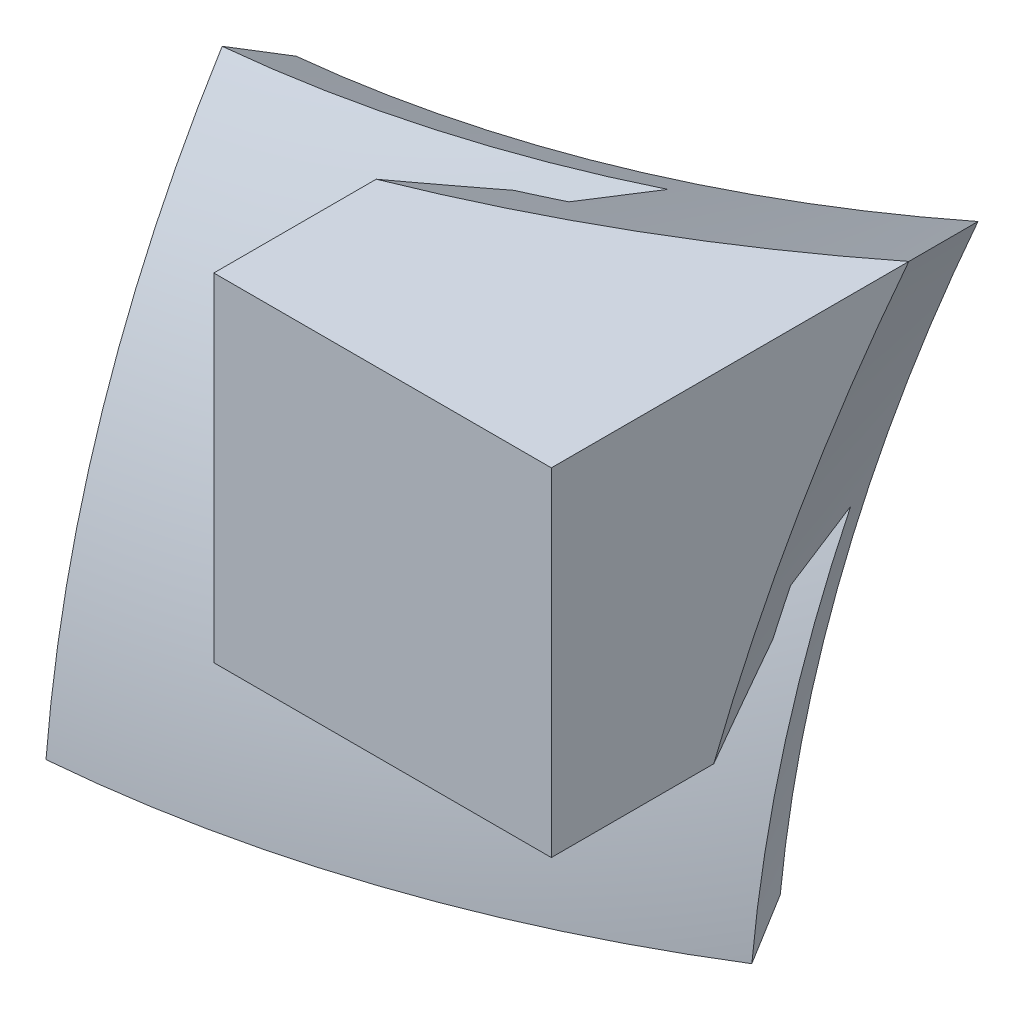
ISO-10303-21;
HEADER;
FILE_DESCRIPTION(('STEP AP214'),'2;1');
FILE_NAME('part.step','',(''),(''),'','','');
FILE_SCHEMA(('AUTOMOTIVE_DESIGN { 1 0 10303 214 1 1 1 1 }'));
ENDSEC;
DATA;
#1=APPLICATION_CONTEXT('core data for automotive mechanical design processes');
#2=APPLICATION_PROTOCOL_DEFINITION('international standard','automotive_design',2000,#1);
#3=PRODUCT_CONTEXT('',#1,'mechanical');
#4=PRODUCT('Part','Part','',(#3));
#5=PRODUCT_RELATED_PRODUCT_CATEGORY('part','',(#4));
#6=PRODUCT_DEFINITION_FORMATION('','',#4);
#7=PRODUCT_DEFINITION_CONTEXT('part definition',#1,'design');
#8=PRODUCT_DEFINITION('design','',#6,#7);
#9=PRODUCT_DEFINITION_SHAPE('','',#8);
#10=(LENGTH_UNIT() NAMED_UNIT(*) SI_UNIT(.MILLI.,.METRE.));
#11=(NAMED_UNIT(*) PLANE_ANGLE_UNIT() SI_UNIT($,.RADIAN.));
#12=(NAMED_UNIT(*) SI_UNIT($,.STERADIAN.) SOLID_ANGLE_UNIT());
#13=UNCERTAINTY_MEASURE_WITH_UNIT(LENGTH_MEASURE(1.E-05),#10,'distance_accuracy_value','');
#14=(GEOMETRIC_REPRESENTATION_CONTEXT(3) GLOBAL_UNCERTAINTY_ASSIGNED_CONTEXT((#13)) GLOBAL_UNIT_ASSIGNED_CONTEXT((#10,
#11,#12)) REPRESENTATION_CONTEXT('',''));
#15=CARTESIAN_POINT('',(0.,0.,0.));
#16=DIRECTION('',(0.,0.,1.));
#17=DIRECTION('',(1.,0.,0.));
#18=AXIS2_PLACEMENT_3D('',#15,#16,#17);
#19=CARTESIAN_POINT('',(19.4999999999999,32.5,0.));
#20=DIRECTION('',(-1.,0.,0.));
#21=DIRECTION('',(0.,0.,-1.));
#22=AXIS2_PLACEMENT_3D('',#19,#20,#21);
#23=PLANE('',#22);
#24=DIRECTION('',(0.,0.,-1.));
#25=VECTOR('',#24,1.);
#26=CARTESIAN_POINT('',(19.5,11.7000000000001,0.));
#27=LINE('',#26,#25);
#28=CARTESIAN_POINT('',(19.5,11.7,33.));
#29=VERTEX_POINT('',#28);
#30=CARTESIAN_POINT('',(19.5,11.7000000000001,29.2465382566894));
#31=VERTEX_POINT('',#30);
#32=EDGE_CURVE('E150',#29,#31,#27,.T.);
#33=ORIENTED_EDGE('',*,*,#32,.T.);
#34=CARTESIAN_POINT('',(19.5,0.,0.));
#35=DIRECTION('',(1.,0.,0.));
#36=DIRECTION('',(0.,0.,-1.));
#37=AXIS2_PLACEMENT_3D('',#34,#35,#36);
#38=CIRCLE('',#37,31.4999999999999);
#39=CARTESIAN_POINT('',(19.5,19.5,24.7386337537059));
#40=VERTEX_POINT('',#39);
#41=EDGE_CURVE('E45',#40,#31,#38,.T.);
#42=ORIENTED_EDGE('',*,*,#41,.F.);
#43=DIRECTION('',(0.,0.,-1.));
#44=VECTOR('',#43,1.);
#45=CARTESIAN_POINT('',(19.5,19.5000000000001,0.));
#46=LINE('',#45,#44);
#47=CARTESIAN_POINT('',(19.5,19.5000000000001,33.));
#48=VERTEX_POINT('',#47);
#49=EDGE_CURVE('E138',#48,#40,#46,.T.);
#50=ORIENTED_EDGE('',*,*,#49,.F.);
#51=DIRECTION('',(0.,1.,0.));
#52=VECTOR('',#51,1.);
#53=CARTESIAN_POINT('',(19.5000000000001,0.,33.));
#54=LINE('',#53,#52);
#55=EDGE_CURVE('E79',#29,#48,#54,.T.);
#56=ORIENTED_EDGE('',*,*,#55,.F.);
#57=EDGE_LOOP('',(#33,#42,#50,#56));
#58=FACE_BOUND('',#57,.T.);
#59=ADVANCED_FACE('F41',(#58),#23,.F.);
#60=CARTESIAN_POINT('',(32.4999999999999,19.5000000000001,0.));
#61=DIRECTION('',(0.,-1.,0.));
#62=DIRECTION('',(0.,0.,-1.));
#63=AXIS2_PLACEMENT_3D('',#60,#61,#62);
#64=PLANE('',#63);
#65=ORIENTED_EDGE('',*,*,#49,.T.);
#66=CARTESIAN_POINT('',(0.,19.5,0.));
#67=DIRECTION('',(0.,-1.,0.));
#68=DIRECTION('',(0.,0.,-1.));
#69=AXIS2_PLACEMENT_3D('',#66,#67,#68);
#70=CIRCLE('',#69,31.4999999999999);
#71=CARTESIAN_POINT('',(11.7,19.5,29.2465382566894));
#72=VERTEX_POINT('',#71);
#73=EDGE_CURVE('E143',#40,#72,#70,.T.);
#74=ORIENTED_EDGE('',*,*,#73,.T.);
#75=DIRECTION('',(0.,0.,-1.));
#76=VECTOR('',#75,1.);
#77=CARTESIAN_POINT('',(11.7,19.5000000000001,0.));
#78=LINE('',#77,#76);
#79=CARTESIAN_POINT('',(11.7,19.5000000000001,33.));
#80=VERTEX_POINT('',#79);
#81=EDGE_CURVE('E172',#80,#72,#78,.T.);
#82=ORIENTED_EDGE('',*,*,#81,.F.);
#83=DIRECTION('',(-1.,0.,0.));
#84=VECTOR('',#83,1.);
#85=CARTESIAN_POINT('',(0.,19.5000000000001,33.));
#86=LINE('',#85,#84);
#87=EDGE_CURVE('E145',#48,#80,#86,.T.);
#88=ORIENTED_EDGE('',*,*,#87,.F.);
#89=EDGE_LOOP('',(#65,#74,#82,#88));
#90=FACE_BOUND('',#89,.T.);
#91=ADVANCED_FACE('F140',(#90),#64,.F.);
#92=CARTESIAN_POINT('',(13.5486364278669,0.,0.));
#93=DIRECTION('',(1.,0.,0.));
#94=DIRECTION('',(0.,0.,1.));
#95=AXIS2_PLACEMENT_3D('',#92,#93,#94);
#96=CONICAL_SURFACE('',#95,21.8862588450156,1.01648883059334);
#97=CARTESIAN_POINT('',(14.6013456570995,0.,0.));
#98=DIRECTION('',(-1.,0.,0.));
#99=DIRECTION('',(0.,-1.,0.));
#100=AXIS2_PLACEMENT_3D('',#97,#98,#99);
#101=CIRCLE('',#100,23.5867891383913);
#102=CARTESIAN_POINT('',(14.6013456570994,10.3743688599618,21.1827546040733));
#103=VERTEX_POINT('',#102);
#104=CARTESIAN_POINT('',(14.6013456570994,2.36043317420627,23.4683824983539));
#105=VERTEX_POINT('',#104);
#106=EDGE_CURVE('E427',#103,#105,#101,.F.);
#107=ORIENTED_EDGE('',*,*,#106,.T.);
#108=CARTESIAN_POINT('',(24.5993379804337,2.36043317420627,39.6672243534467));
#109=CARTESIAN_POINT('',(23.7135950293793,2.36043317420627,38.2338527694047));
#110=CARTESIAN_POINT('',(22.8279537319469,2.36043317420627,36.8004183129105));
#111=CARTESIAN_POINT('',(21.0570270708889,2.36043317420627,33.9333410794372));
#112=CARTESIAN_POINT('',(20.1717417052222,2.36043317420627,32.4996983037187));
#113=CARTESIAN_POINT('',(18.4016864972902,2.36043317420627,29.6321331625707));
#114=CARTESIAN_POINT('',(17.5169166453003,2.36043317420627,28.1982108031442));
#115=CARTESIAN_POINT('',(15.7481433348418,2.36043317420627,25.3298820901043));
#116=CARTESIAN_POINT('',(14.8641398807546,2.36043317420627,23.8954757337882));
#117=CARTESIAN_POINT('',(13.5391009545038,2.36043317420627,21.7432329454314));
#118=CARTESIAN_POINT('',(13.097573813547,2.36043317420627,21.0256992382864));
#119=CARTESIAN_POINT('',(12.2149691447458,2.36043317420627,19.5903568905841));
#120=CARTESIAN_POINT('',(11.7738916161883,2.36043317420627,18.8725482504653));
#121=CARTESIAN_POINT('',(10.8923655493752,2.36043317420627,17.4365603833588));
#122=CARTESIAN_POINT('',(10.4519170012715,2.36043317420627,16.7183811624184));
#123=CARTESIAN_POINT('',(9.57192167167061,2.36043317420627,15.2814647080534));
#124=CARTESIAN_POINT('',(9.13237489535332,2.36043317420627,14.5627274714561));
#125=CARTESIAN_POINT('',(8.25462626435377,2.36043317420627,13.1243780284814));
#126=CARTESIAN_POINT('',(7.81642448362479,2.36043317420627,12.4047657769252));
#127=CARTESIAN_POINT('',(7.16082863751445,2.36043317420627,11.324320116887));
#128=CARTESIAN_POINT('',(6.94258306131177,2.36043317420627,10.9640035061726));
#129=CARTESIAN_POINT('',(6.50685386593697,2.36043317420627,10.2429077123471));
#130=CARTESIAN_POINT('',(6.28937024968975,2.36043317420627,9.88212852746746));
#131=CARTESIAN_POINT('',(5.85542639213522,2.36043317420627,9.15992114659262));
#132=CARTESIAN_POINT('',(5.63896622231247,2.36043317420627,8.79849290762643));
#133=CARTESIAN_POINT('',(5.20750945525894,2.36043317420627,8.07476758220636));
#134=CARTESIAN_POINT('',(4.99251284256307,2.36043317420627,7.71247050498816));
#135=CARTESIAN_POINT('',(4.67163972631961,2.36043317420627,7.16805323406913));
#136=CARTESIAN_POINT('',(4.56494895683102,2.36043317420627,6.9864130804957));
#137=CARTESIAN_POINT('',(4.35224866349939,2.36043317420627,6.62273508813042));
#138=CARTESIAN_POINT('',(4.24623913705494,2.36043317420627,6.44069725086074));
#139=CARTESIAN_POINT('',(4.0350665234058,2.36043317420627,6.07612184439681));
#140=CARTESIAN_POINT('',(3.92990346663647,2.36043317420627,5.89358425754721));
#141=CARTESIAN_POINT('',(3.72068878746636,2.36043317420627,5.52787040737645));
#142=CARTESIAN_POINT('',(3.61663717976186,2.36043317420627,5.34469413565259));
#143=CARTESIAN_POINT('',(3.51327326796035,2.36043317420627,5.1611282121176));
#144=B_SPLINE_CURVE_WITH_KNOTS('',3,(#108,#109,#110,#111,#112,#113,#114,#115,#116,#117,#118,
#119,#120,#121,#122,#123,#124,#125,#126,#127,#128,#129,#130,#131,#132,#133,#134,#135,#136,#137,
#138,#139,#140,#141,#142,#143),.UNSPECIFIED.,.F.,.F.,(4,2,2,2,2,2,2,2,2,2,2,2,2,2,2,2,2,4),(0.,
5.05488405272402,10.109738694061,15.1644946772692,20.2192793700094,22.7467696141236,
25.2742558429551,27.8017020545297,30.3291627437276,32.8567599989275,34.1205365165781,
35.384317880162,36.6481862482286,37.9120412404829,38.5440089019537,39.1759741487419,
39.8079620176437,40.4399582327647),.UNSPECIFIED.);
#145=CARTESIAN_POINT('',(13.5486364278669,2.36043317420627,21.7586001723716));
#146=VERTEX_POINT('',#145);
#147=EDGE_CURVE('E72',#105,#146,#144,.T.);
#148=ORIENTED_EDGE('',*,*,#147,.T.);
#149=CARTESIAN_POINT('',(13.5486364278669,0.,0.));
#150=DIRECTION('',(1.,0.,0.));
#151=DIRECTION('',(0.,0.,-1.));
#152=AXIS2_PLACEMENT_3D('',#149,#150,#151);
#153=CIRCLE('',#152,21.8862588450156);
#154=CARTESIAN_POINT('',(13.5486364278668,13.5486364278669,17.188448946211));
#155=VERTEX_POINT('',#154);
#156=EDGE_CURVE('E161',#155,#146,#153,.T.);
#157=ORIENTED_EDGE('',*,*,#156,.F.);
#158=DIRECTION('',(0.526354614616295,0.526354614616297,0.667758668490542));
#159=VECTOR('',#158,1.);
#160=CARTESIAN_POINT('',(0.,0.,0.));
#161=LINE('',#160,#159);
#162=EDGE_CURVE('E146',#40,#155,#161,.F.);
#163=ORIENTED_EDGE('',*,*,#162,.F.);
#164=ORIENTED_EDGE('',*,*,#41,.T.);
#165=CARTESIAN_POINT('',(29.9831042332942,11.7000000000001,46.9998523165172));
#166=CARTESIAN_POINT('',(29.5695460419096,11.7000000000001,46.3114035057555));
#167=CARTESIAN_POINT('',(29.1563727624076,11.7000000000001,45.6227235286328));
#168=CARTESIAN_POINT('',(28.3309145968263,11.7000000000001,44.2448305512274));
#169=CARTESIAN_POINT('',(27.9186297115495,11.7000000000001,43.555617550464));
#170=CARTESIAN_POINT('',(26.6832428349779,11.7000000000001,41.4870015235794));
#171=CARTESIAN_POINT('',(25.8616526236678,11.7000000000001,40.1066946636882));
#172=CARTESIAN_POINT('',(24.2230959746683,11.7000000000001,37.3416252164109));
#173=CARTESIAN_POINT('',(23.4061344741696,11.7000000000001,35.9568597018244));
#174=CARTESIAN_POINT('',(21.7796223492399,11.7000000000001,33.1830492762636));
#175=CARTESIAN_POINT('',(20.970071426122,11.7000000000001,31.7940045408084));
#176=CARTESIAN_POINT('',(19.7705932500849,11.7000000000001,29.7178208854183));
#177=CARTESIAN_POINT('',(19.3766538702403,11.7000000000001,29.0330001316483));
#178=CARTESIAN_POINT('',(18.5918894504467,11.7000000000001,27.6615773365093));
#179=CARTESIAN_POINT('',(18.2010644029119,11.7000000000001,26.9749752994846));
#180=CARTESIAN_POINT('',(17.423168342795,11.7000000000001,25.5995290510725));
#181=CARTESIAN_POINT('',(17.036097821589,11.7000000000001,24.9106845615479));
#182=CARTESIAN_POINT('',(16.2666803040386,11.7000000000001,23.5303641361797));
#183=CARTESIAN_POINT('',(15.8843332831974,11.7000000000001,22.8388882140075));
#184=CARTESIAN_POINT('',(15.1254733333848,11.7000000000001,21.4524772962229));
#185=CARTESIAN_POINT('',(14.7489621260672,11.7000000000001,20.7575413568386));
#186=CARTESIAN_POINT('',(14.0035422153921,11.7000000000001,19.3635718196275));
#187=CARTESIAN_POINT('',(13.6346337030667,11.7000000000001,18.6645381194022));
#188=CARTESIAN_POINT('',(12.9068241377435,11.7000000000001,17.2614510623169));
#189=CARTESIAN_POINT('',(12.5479210327491,11.7000000000001,16.5573987724639));
#190=CARTESIAN_POINT('',(11.8433270003428,11.7000000000001,15.1427313714644));
#191=CARTESIAN_POINT('',(11.497635196273,11.7000000000001,14.4321166996746));
#192=CARTESIAN_POINT('',(10.9364574878759,11.7000000000001,13.240600979307));
#193=CARTESIAN_POINT('',(10.7159690889732,11.7000000000001,12.7620597933423));
#194=CARTESIAN_POINT('',(10.2849806158187,11.7000000000001,11.8004978032896));
#195=CARTESIAN_POINT('',(10.0744802539218,11.7000000000001,11.3174771286857));
#196=CARTESIAN_POINT('',(9.66645541430141,11.7000000000001,10.3472711456755));
#197=CARTESIAN_POINT('',(9.4689021222929,11.7000000000001,9.86009801543928));
#198=CARTESIAN_POINT('',(9.08946560082895,11.7000000000001,8.87955373046023));
#199=CARTESIAN_POINT('',(8.90758483272758,11.7000000000001,8.3861816160635));
#200=CARTESIAN_POINT('',(8.5624843162843,11.7000000000001,7.38905623057931));
#201=CARTESIAN_POINT('',(8.39940314340287,11.7000000000001,6.88525462559466));
#202=CARTESIAN_POINT('',(8.09868484115985,11.7000000000001,5.87024913974239));
#203=CARTESIAN_POINT('',(7.96103480095306,11.7000000000001,5.35904915780938));
#204=CARTESIAN_POINT('',(7.77767829893197,11.7000000000001,4.58476199325067));
#205=CARTESIAN_POINT('',(7.720241995675,11.7000000000001,4.32443264170045));
#206=CARTESIAN_POINT('',(7.61414186909903,11.7000000000001,3.80199727296307));
#207=CARTESIAN_POINT('',(7.5654774514676,11.7000000000001,3.53989137738966));
#208=CARTESIAN_POINT('',(7.47762859472269,11.7000000000001,3.01369854516661));
#209=CARTESIAN_POINT('',(7.43845788058526,11.7000000000001,2.74960930277732));
#210=CARTESIAN_POINT('',(7.37033995165896,11.7000000000001,2.22004865762173));
#211=CARTESIAN_POINT('',(7.34139544112448,11.7000000000001,1.95457690806531));
#212=CARTESIAN_POINT('',(7.31790114012981,11.7000000000001,1.68859662969376));
#213=B_SPLINE_CURVE_WITH_KNOTS('',3,(#165,#166,#167,#168,#169,#170,#171,#172,#173,#174,#175,
#176,#177,#178,#179,#180,#181,#182,#183,#184,#185,#186,#187,#188,#189,#190,#191,#192,#193,#194,
#195,#196,#197,#198,#199,#200,#201,#202,#203,#204,#205,#206,#207,#208,#209,#210,#211,#212),
.UNSPECIFIED.,.F.,.F.,(4,2,2,2,2,2,2,2,2,2,2,2,2,2,2,2,2,2,2,2,2,2,2,4),(0.,2.40934177011957,
4.81868571602445,9.63762980352724,14.4609978331241,19.2841705909017,21.6542928680232,
24.0244093702654,26.3948319875908,28.7652423064302,31.1363391094846,33.5074954184083,
35.8781617978656,38.2486705936817,39.8292635557093,41.4098109706272,42.9867121606657,
44.5638605517928,46.1519772751732,47.7392855165716,48.5389310863669,49.3385224582279,
50.1392629888806,50.9402151120507),.UNSPECIFIED.);
#214=CARTESIAN_POINT('',(17.6869248733467,11.7000000000001,26.0657378281258));
#215=VERTEX_POINT('',#214);
#216=EDGE_CURVE('E163',#31,#215,#213,.T.);
#217=ORIENTED_EDGE('',*,*,#216,.T.);
#218=CARTESIAN_POINT('',(17.6869248733468,0.,0.));
#219=DIRECTION('',(-1.,0.,0.));
#220=DIRECTION('',(0.,-1.,0.));
#221=AXIS2_PLACEMENT_3D('',#218,#219,#220);
#222=CIRCLE('',#221,28.5711863338677);
#223=CARTESIAN_POINT('',(17.6869248733467,12.5666967239637,25.6591274592982));
#224=VERTEX_POINT('',#223);
#225=EDGE_CURVE('E418',#215,#224,#222,.T.);
#226=ORIENTED_EDGE('',*,*,#225,.T.);
#227=DIRECTION('',(0.526354614616296,0.373979018880187,0.763603636129074));
#228=VECTOR('',#227,1.);
#229=CARTESIAN_POINT('',(0.,0.,0.));
#230=LINE('',#229,#228);
#231=EDGE_CURVE('E421',#224,#103,#230,.F.);
#232=ORIENTED_EDGE('',*,*,#231,.T.);
#233=EDGE_LOOP('',(#107,#148,#157,#163,#164,#217,#226,#232));
#234=FACE_BOUND('',#233,.T.);
#235=ADVANCED_FACE('F159',(#234),#96,.F.);
#236=CARTESIAN_POINT('',(0.,13.5486364278669,0.));
#237=DIRECTION('',(0.,1.,0.));
#238=DIRECTION('',(0.,0.,1.));
#239=AXIS2_PLACEMENT_3D('',#236,#237,#238);
#240=CONICAL_SURFACE('',#239,21.8862588450156,1.01648883059334);
#241=ORIENTED_EDGE('',*,*,#162,.T.);
#242=CARTESIAN_POINT('',(0.,13.5486364278669,0.));
#243=DIRECTION('',(0.,-1.,0.));
#244=DIRECTION('',(0.,0.,-1.));
#245=AXIS2_PLACEMENT_3D('',#242,#243,#244);
#246=CIRCLE('',#245,21.8862588450156);
#247=CARTESIAN_POINT('',(2.36043317420622,13.5486364278669,21.7586001723716));
#248=VERTEX_POINT('',#247);
#249=EDGE_CURVE('E147',#155,#248,#246,.T.);
#250=ORIENTED_EDGE('',*,*,#249,.T.);
#251=CARTESIAN_POINT('',(2.36043317420617,26.619929593572,42.9365914328866));
#252=CARTESIAN_POINT('',(2.36043317420618,25.5710322322244,41.2396246888175));
#253=CARTESIAN_POINT('',(2.36043317420618,24.5222408798586,39.5425923491005));
#254=CARTESIAN_POINT('',(2.36043317420619,22.4248225402445,36.147892737757));
#255=CARTESIAN_POINT('',(2.36043317420619,21.3761956446419,34.4502254095094));
#256=CARTESIAN_POINT('',(2.3604331742062,19.3069579514227,31.0989360693611));
#257=CARTESIAN_POINT('',(2.3604331742062,18.2863318182161,29.4453235269724));
#258=CARTESIAN_POINT('',(2.36043317420621,16.2462169669925,26.1379054096221));
#259=CARTESIAN_POINT('',(2.36043317420621,15.2267280462032,24.4840999597801));
#260=CARTESIAN_POINT('',(2.36043317420622,13.6619923093734,21.9429646085923));
#261=CARTESIAN_POINT('',(2.36043317420622,13.116157695457,21.0559967100844));
#262=CARTESIAN_POINT('',(2.36043317420623,12.0248803774445,19.281135075838));
#263=CARTESIAN_POINT('',(2.36043317420623,11.4794380641415,18.3932410997939));
#264=CARTESIAN_POINT('',(2.36043317420623,10.3797895937522,16.6008211928615));
#265=CARTESIAN_POINT('',(2.36043317420623,9.82560243502976,15.6962835986223));
#266=CARTESIAN_POINT('',(2.36043317420624,8.99619070518066,14.3395016187839));
#267=CARTESIAN_POINT('',(2.36043317420624,8.72029046892441,13.8876703419258));
#268=CARTESIAN_POINT('',(2.36043317420624,8.16911258156393,12.9836724417892));
#269=CARTESIAN_POINT('',(2.36043317420624,7.89383488734568,12.5315058448045));
#270=CARTESIAN_POINT('',(2.36043317420624,7.34119805604209,11.6219012128796));
#271=CARTESIAN_POINT('',(2.36043317420624,7.06384760444124,11.1644578979698));
#272=CARTESIAN_POINT('',(2.36043317420625,6.51026155911518,10.2487297094532));
#273=CARTESIAN_POINT('',(2.36043317420625,6.23402628368307,9.79044464335742));
#274=CARTESIAN_POINT('',(2.36043317420625,5.6812653862088,8.86941641185102));
#275=CARTESIAN_POINT('',(2.36043317420625,5.40475281609194,8.40666539750241));
#276=CARTESIAN_POINT('',(2.36043317420625,4.99225057896984,7.71150181027241));
#277=CARTESIAN_POINT('',(2.36043317420625,4.85519457731458,7.47972223014585));
#278=CARTESIAN_POINT('',(2.36043317420625,4.582011715615,7.01561645111804));
#279=CARTESIAN_POINT('',(2.36043317420625,4.44588485328745,6.78329025356191));
#280=CARTESIAN_POINT('',(2.36043317420625,4.17935726447006,6.32564720203838));
#281=CARTESIAN_POINT('',(2.36043317420625,4.04891647148638,6.1003537088167));
#282=CARTESIAN_POINT('',(2.36043317420625,3.78957155767955,5.64886095640825));
#283=CARTESIAN_POINT('',(2.36043317420626,3.66066754937842,5.42266163249764));
#284=CARTESIAN_POINT('',(2.36043317420626,3.40452222352072,4.96819802084353));
#285=CARTESIAN_POINT('',(2.36043317420626,3.27728898354574,4.73992916627204));
#286=CARTESIAN_POINT('',(2.36043317420626,3.02597156335901,4.28173456250547));
#287=CARTESIAN_POINT('',(2.36043317420626,2.90188660435961,4.0518092414994));
#288=CARTESIAN_POINT('',(2.36043317420626,2.6602062575563,3.59294018778644));
#289=CARTESIAN_POINT('',(2.36043317420626,2.54254147724283,3.36403339622176));
#290=CARTESIAN_POINT('',(2.36043317420626,2.37139263190792,3.01785707789071));
#291=CARTESIAN_POINT('',(2.36043317420626,2.31520338638938,2.90192759668437));
#292=CARTESIAN_POINT('',(2.36043317420626,2.20517485308369,2.66896171377489));
#293=CARTESIAN_POINT('',(2.36043317420626,2.15133543065929,2.55192537595979));
#294=CARTESIAN_POINT('',(2.36043317420626,2.04705218563727,2.31727283624103));
#295=CARTESIAN_POINT('',(2.36043317420626,1.99658817725604,2.19966565488192));
#296=CARTESIAN_POINT('',(2.36043317420626,1.89960967067643,1.96279398197097));
#297=CARTESIAN_POINT('',(2.36043317420626,1.85309589908175,1.84352919019391));
#298=CARTESIAN_POINT('',(2.36043317420626,1.76541202823339,1.6033161839427));
#299=CARTESIAN_POINT('',(2.36043317420626,1.72423093182172,1.48237202237289));
#300=CARTESIAN_POINT('',(2.36043317420626,1.64880953540113,1.23835971266929));
#301=CARTESIAN_POINT('',(2.36043317420626,1.61456535800003,1.11529279303017));
#302=CARTESIAN_POINT('',(2.36043317420626,1.56928982683882,0.926378621575442));
#303=CARTESIAN_POINT('',(2.36043317420626,1.55498888519454,0.861311211576187));
#304=CARTESIAN_POINT('',(2.36043317420626,1.52913362314857,0.730600803350086));
#305=CARTESIAN_POINT('',(2.36043317420626,1.51758037560672,0.664957590635291));
#306=CARTESIAN_POINT('',(2.36043317420626,1.49752274297753,0.53324516087108));
#307=CARTESIAN_POINT('',(2.36043317420626,1.48901647281298,0.467176233047779));
#308=CARTESIAN_POINT('',(2.36043317420626,1.47528344617286,0.3346994300471));
#309=CARTESIAN_POINT('',(2.36043317420626,1.47005648941747,0.268291575818993));
#310=CARTESIAN_POINT('',(2.36043317420626,1.46306417078121,0.135667805571118));
#311=CARTESIAN_POINT('',(2.36043317420626,1.46127940304223,0.0694529274199769));
#312=CARTESIAN_POINT('',(2.36043317420626,1.46116442151914,-0.0629745663610503));
#313=CARTESIAN_POINT('',(2.36043317420626,1.46283413609844,-0.129187182009381));
#314=CARTESIAN_POINT('',(2.36043317420626,1.47297782330653,-0.327630408068568));
#315=CARTESIAN_POINT('',(2.36043317420626,1.48658879344487,-0.459619313941572));
#316=CARTESIAN_POINT('',(2.36043317420626,1.53575792607524,-0.786920181593879));
#317=CARTESIAN_POINT('',(2.36043317420626,1.57886508571607,-0.981074814011124));
#318=CARTESIAN_POINT('',(2.36043317420626,1.65832963321663,-1.26972707229178));
#319=CARTESIAN_POINT('',(2.36043317420626,1.68760384939981,-1.36633652509036));
#320=CARTESIAN_POINT('',(2.36043317420626,1.75016332915719,-1.55817061411379));
#321=CARTESIAN_POINT('',(2.36043317420626,1.78344541785173,-1.65339628036873));
#322=CARTESIAN_POINT('',(2.36043317420626,1.81828611737348,-1.74805138566637));
#323=B_SPLINE_CURVE_WITH_KNOTS('',3,(#251,#252,#253,#254,#255,#256,#257,#258,#259,#260,#261,
#262,#263,#264,#265,#266,#267,#268,#269,#270,#271,#272,#273,#274,#275,#276,#277,#278,#279,#280,
#281,#282,#283,#284,#285,#286,#287,#288,#289,#290,#291,#292,#293,#294,#295,#296,#297,#298,#299,
#300,#301,#302,#303,#304,#305,#306,#307,#308,#309,#310,#311,#312,#313,#314,#315,#316,#317,#318,
#319,#320,#321,#322),.UNSPECIFIED.,.F.,.F.,(4,2,2,2,2,2,2,2,2,2,2,2,2,2,2,2,2,2,2,2,2,2,2,2,2,2,
2,2,2,2,2,2,2,2,2,4),(0.,5.98489242751292,11.9711461502808,17.8008123349799,23.6291795010934,
26.7535715780533,29.8797137812791,33.0621335139914,34.6503560733964,36.2384650485755,
37.84333096421,39.4486264640985,41.0658323198172,41.8736395761448,42.6814448466791,
43.4624317764314,44.2434755424353,45.0274570629519,45.8112427215375,46.5832806386109,
46.969747911041,47.3561930110002,47.7400702758923,48.1240179986458,48.5071608800361,
48.8900890091048,49.0899013526739,49.2897915870012,49.4895579405277,49.6893120923945,
49.8879367700274,50.0865573287644,50.4839391715569,51.0789744744686,51.3817639678797,
51.6843151619438),.UNSPECIFIED.);
#324=CARTESIAN_POINT('',(2.36043317420622,14.6013456570995,23.4683824983538));
#325=VERTEX_POINT('',#324);
#326=EDGE_CURVE('E60',#325,#248,#323,.T.);
#327=ORIENTED_EDGE('',*,*,#326,.F.);
#328=CARTESIAN_POINT('',(0.,14.6013456570995,0.));
#329=DIRECTION('',(0.,-1.,0.));
#330=DIRECTION('',(0.,0.,-1.));
#331=AXIS2_PLACEMENT_3D('',#328,#329,#330);
#332=CIRCLE('',#331,23.5867891383913);
#333=CARTESIAN_POINT('',(10.3743688599618,14.6013456570995,21.1827546040733));
#334=VERTEX_POINT('',#333);
#335=EDGE_CURVE('E248',#334,#325,#332,.T.);
#336=ORIENTED_EDGE('',*,*,#335,.F.);
#337=DIRECTION('',(0.373979018880185,0.526354614616297,0.763603636129074));
#338=VECTOR('',#337,1.);
#339=CARTESIAN_POINT('',(0.,0.,0.));
#340=LINE('',#339,#338);
#341=CARTESIAN_POINT('',(12.5666967239637,17.6869248733468,25.6591274592983));
#342=VERTEX_POINT('',#341);
#343=EDGE_CURVE('E463',#342,#334,#340,.F.);
#344=ORIENTED_EDGE('',*,*,#343,.F.);
#345=CARTESIAN_POINT('',(0.,17.6869248733468,0.));
#346=DIRECTION('',(0.,-1.,0.));
#347=DIRECTION('',(0.,0.,-1.));
#348=AXIS2_PLACEMENT_3D('',#345,#346,#347);
#349=CIRCLE('',#348,28.5711863338677);
#350=CARTESIAN_POINT('',(11.7,17.6869248733468,26.0657378281258));
#351=VERTEX_POINT('',#350);
#352=EDGE_CURVE('E235',#351,#342,#349,.F.);
#353=ORIENTED_EDGE('',*,*,#352,.F.);
#354=CARTESIAN_POINT('',(11.6999999999999,29.7074267118337,46.5408041375429));
#355=CARTESIAN_POINT('',(11.6999999999999,29.2609201603327,45.7970697869244));
#356=CARTESIAN_POINT('',(11.7,28.8148709598534,45.0530605210145));
#357=CARTESIAN_POINT('',(11.7,27.9238518884757,43.5643946388504));
#358=CARTESIAN_POINT('',(11.7,27.4788820190593,42.8197380217091));
#359=CARTESIAN_POINT('',(11.7,26.5901199069055,41.3295686868859));
#360=CARTESIAN_POINT('',(11.7,26.1463278534954,40.5840558562585));
#361=CARTESIAN_POINT('',(11.7,25.2602010281822,39.0921648375157));
#362=CARTESIAN_POINT('',(11.7,24.8178662556956,38.3457866497471));
#363=CARTESIAN_POINT('',(11.7,23.9325135434305,36.8479573163143));
#364=CARTESIAN_POINT('',(11.7,23.4895049522325,36.0965006431442));
#365=CARTESIAN_POINT('',(11.7,22.6055517134068,34.592374464476));
#366=CARTESIAN_POINT('',(11.7,22.1646070646244,33.8397049596566));
#367=CARTESIAN_POINT('',(11.7,21.2852547237783,32.3330144351188));
#368=CARTESIAN_POINT('',(11.7,20.8468467129456,31.5789936015308));
#369=CARTESIAN_POINT('',(11.7,19.9730457023069,30.0692073495636));
#370=CARTESIAN_POINT('',(11.7,19.5376526981281,29.3134419337168));
#371=CARTESIAN_POINT('',(11.7,18.6806034362772,27.8172836473201));
#372=CARTESIAN_POINT('',(11.7,18.2588623392676,27.0769394125518));
#373=CARTESIAN_POINT('',(11.7,17.4197790730694,25.5937537840755));
#374=CARTESIAN_POINT('',(11.7,17.0024369315871,24.8509123746782));
#375=CARTESIAN_POINT('',(11.7,16.1731349399335,23.361828029165));
#376=CARTESIAN_POINT('',(11.7,15.7611773628193,22.615583825167));
#377=CARTESIAN_POINT('',(11.7,14.9444080373864,21.1192074027177));
#378=CARTESIAN_POINT('',(11.7,14.5395961581409,20.3690752558293));
#379=CARTESIAN_POINT('',(11.7,13.7402404698309,18.8655956829712));
#380=CARTESIAN_POINT('',(11.7,13.3456747995929,18.1122599287619));
#381=CARTESIAN_POINT('',(11.7,12.7631670828778,16.9774140176895));
#382=CARTESIAN_POINT('',(11.7,12.5705450029156,16.5983054337027));
#383=CARTESIAN_POINT('',(11.7,12.1889625921286,15.8382515240906));
#384=CARTESIAN_POINT('',(11.7,12.0000022268154,15.457306215807));
#385=CARTESIAN_POINT('',(11.7,11.6265041889721,14.6935733669196));
#386=CARTESIAN_POINT('',(11.7,11.441963581981,14.3107872633508));
#387=CARTESIAN_POINT('',(11.7,11.0779567502405,13.5428139496785));
#388=CARTESIAN_POINT('',(11.7,10.8984904279716,13.1576267858934));
#389=CARTESIAN_POINT('',(11.7,10.5456198391826,12.3845590586551));
#390=CARTESIAN_POINT('',(11.7,10.3722145603057,11.9966789580927));
#391=CARTESIAN_POINT('',(11.7,10.0326229254544,11.2177791761914));
#392=CARTESIAN_POINT('',(11.7,9.86643621028595,10.8267596522193));
#393=CARTESIAN_POINT('',(11.7,9.64017195314044,10.2775970185747));
#394=CARTESIAN_POINT('',(11.7,9.57643831959797,10.1209564371736));
#395=CARTESIAN_POINT('',(11.7,9.45045702991963,9.80707847738329));
#396=CARTESIAN_POINT('',(11.7,9.38820937727314,9.64984109759358));
#397=CARTESIAN_POINT('',(11.7,9.20386157797315,9.17718317811795));
#398=CARTESIAN_POINT('',(11.7,9.08415859416314,8.86082170404086));
#399=CARTESIAN_POINT('',(11.7,8.85229199658402,8.22566740133268));
#400=CARTESIAN_POINT('',(11.7,8.7401216155839,7.90687704948484));
#401=CARTESIAN_POINT('',(11.7,8.52439834959384,7.26636892530595));
#402=CARTESIAN_POINT('',(11.7,8.42084576901492,6.9446510500094));
#403=CARTESIAN_POINT('',(11.7,8.22330735898987,6.29676566864194));
#404=CARTESIAN_POINT('',(11.7,8.12936451072716,5.97058498908834));
#405=CARTESIAN_POINT('',(11.7,7.95309934594948,5.31513119447302));
#406=CARTESIAN_POINT('',(11.7,7.87077541231709,4.98585851657191));
#407=CARTESIAN_POINT('',(11.7,7.71912703264904,4.32317848331582));
#408=CARTESIAN_POINT('',(11.7,7.6498456165301,3.98976118117831));
#409=CARTESIAN_POINT('',(11.7,7.5262012161852,3.32000667930699));
#410=CARTESIAN_POINT('',(11.7,7.47184589303609,2.98366807118428));
#411=CARTESIAN_POINT('',(11.7,7.42578402928836,2.64612073580385));
#412=B_SPLINE_CURVE_WITH_KNOTS('',3,(#354,#355,#356,#357,#358,#359,#360,#361,#362,#363,#364,
#365,#366,#367,#368,#369,#370,#371,#372,#373,#374,#375,#376,#377,#378,#379,#380,#381,#382,#383,
#384,#385,#386,#387,#388,#389,#390,#391,#392,#393,#394,#395,#396,#397,#398,#399,#400,#401,#402,
#403,#404,#405,#406,#407,#408,#409,#410,#411),.UNSPECIFIED.,.F.,.F.,(4,2,2,2,2,2,2,2,2,2,2,2,2,
2,2,2,2,2,2,2,2,2,2,2,2,2,2,2,4),(0.,2.60241837047737,5.20484031236513,7.80765791656567,
10.4104744783872,13.0274344254209,15.6443929082405,18.2610150566178,20.8776334091206,
23.4337466681552,25.989876016932,28.5470516651012,31.1041804108275,33.6553100560232,
34.9310057349474,36.2066893926891,37.4815011734987,38.7562884378316,40.0308617509679,
41.3053715688059,41.8126956418228,42.3200209060185,43.3346871631958,44.3484293076381,
45.3622072458321,46.3803375908546,47.3983260927362,48.4196164408409,49.4414300083376),.UNSPECIFIED.);
#413=EDGE_CURVE('E158',#72,#351,#412,.T.);
#414=ORIENTED_EDGE('',*,*,#413,.F.);
#415=ORIENTED_EDGE('',*,*,#73,.F.);
#416=EDGE_LOOP('',(#241,#250,#327,#336,#344,#353,#414,#415));
#417=FACE_BOUND('',#416,.T.);
#418=ADVANCED_FACE('F155',(#417),#240,.F.);
#419=CARTESIAN_POINT('',(0.,0.,0.));
#420=DIRECTION('',(0.,-1.,0.));
#421=DIRECTION('',(1.,0.,0.));
#422=AXIS2_PLACEMENT_3D('',#419,#420,#421);
#423=SPHERICAL_SURFACE('',#422,25.7405103928719);
#424=ORIENTED_EDGE('',*,*,#156,.T.);
#425=CARTESIAN_POINT('',(0.,2.36043317420627,0.));
#426=DIRECTION('',(0.,-1.,0.));
#427=DIRECTION('',(0.,0.,-1.));
#428=AXIS2_PLACEMENT_3D('',#425,#426,#427);
#429=CIRCLE('',#428,25.6320547462674);
#430=CARTESIAN_POINT('',(2.36043317420626,2.36043317420627,25.5231382424998));
#431=VERTEX_POINT('',#430);
#432=EDGE_CURVE('E194',#146,#431,#429,.T.);
#433=ORIENTED_EDGE('',*,*,#432,.T.);
#434=CARTESIAN_POINT('',(2.36043317420627,0.,0.));
#435=DIRECTION('',(-1.,0.,0.));
#436=DIRECTION('',(0.,-1.,0.));
#437=AXIS2_PLACEMENT_3D('',#434,#435,#436);
#438=CIRCLE('',#437,25.6320547462674);
#439=EDGE_CURVE('E176',#248,#431,#438,.F.);
#440=ORIENTED_EDGE('',*,*,#439,.F.);
#441=ORIENTED_EDGE('',*,*,#249,.F.);
#442=EDGE_LOOP('',(#424,#433,#440,#441));
#443=FACE_BOUND('',#442,.T.);
#444=ADVANCED_FACE('F200',(#443),#423,.F.);
#445=CARTESIAN_POINT('',(27.6399036193533,2.36043317420627,0.));
#446=DIRECTION('',(0.,-1.,0.));
#447=DIRECTION('',(0.,0.,-1.));
#448=AXIS2_PLACEMENT_3D('',#445,#446,#447);
#449=PLANE('',#448);
#450=ORIENTED_EDGE('',*,*,#147,.F.);
#451=CARTESIAN_POINT('',(0.,2.36043317420627,0.));
#452=DIRECTION('',(0.,-1.,0.));
#453=DIRECTION('',(0.,0.,-1.));
#454=AXIS2_PLACEMENT_3D('',#451,#452,#453);
#455=CIRCLE('',#454,27.6399036193533);
#456=CARTESIAN_POINT('',(2.36043317420626,2.36043317420627,27.5389293059343));
#457=VERTEX_POINT('',#456);
#458=EDGE_CURVE('E183',#105,#457,#455,.T.);
#459=ORIENTED_EDGE('',*,*,#458,.T.);
#460=DIRECTION('',(0.,0.,-1.));
#461=VECTOR('',#460,1.);
#462=CARTESIAN_POINT('',(2.36043317420626,2.36043317420627,0.));
#463=LINE('',#462,#461);
#464=EDGE_CURVE('E432',#457,#431,#463,.T.);
#465=ORIENTED_EDGE('',*,*,#464,.T.);
#466=ORIENTED_EDGE('',*,*,#432,.F.);
#467=EDGE_LOOP('',(#450,#459,#465,#466));
#468=FACE_BOUND('',#467,.T.);
#469=ADVANCED_FACE('F202',(#468),#449,.T.);
#470=CARTESIAN_POINT('',(32.5,11.7000000000001,0.));
#471=DIRECTION('',(0.,-1.,0.));
#472=DIRECTION('',(0.,0.,-1.));
#473=AXIS2_PLACEMENT_3D('',#470,#471,#472);
#474=PLANE('',#473);
#475=ORIENTED_EDGE('',*,*,#32,.F.);
#476=DIRECTION('',(-1.,0.,0.));
#477=VECTOR('',#476,1.);
#478=CARTESIAN_POINT('',(0.,11.7000000000001,33.));
#479=LINE('',#478,#477);
#480=CARTESIAN_POINT('',(11.7,11.7000000000001,33.));
#481=VERTEX_POINT('',#480);
#482=EDGE_CURVE('E186',#29,#481,#479,.T.);
#483=ORIENTED_EDGE('',*,*,#482,.T.);
#484=DIRECTION('',(0.,0.,-1.));
#485=VECTOR('',#484,1.);
#486=CARTESIAN_POINT('',(11.7,11.7000000000001,0.));
#487=LINE('',#486,#485);
#488=CARTESIAN_POINT('',(11.7,11.7000000000001,29.2465382566895));
#489=VERTEX_POINT('',#488);
#490=EDGE_CURVE('E420',#481,#489,#487,.T.);
#491=ORIENTED_EDGE('',*,*,#490,.T.);
#492=CARTESIAN_POINT('',(0.,11.7000000000001,0.));
#493=DIRECTION('',(0.,-1.,0.));
#494=DIRECTION('',(0.,0.,-1.));
#495=AXIS2_PLACEMENT_3D('',#492,#493,#494);
#496=CIRCLE('',#495,31.5);
#497=EDGE_CURVE('E173',#215,#489,#496,.T.);
#498=ORIENTED_EDGE('',*,*,#497,.F.);
#499=ORIENTED_EDGE('',*,*,#216,.F.);
#500=EDGE_LOOP('',(#475,#483,#491,#498,#499));
#501=FACE_BOUND('',#500,.T.);
#502=ADVANCED_FACE('F213',(#501),#474,.T.);
#503=CARTESIAN_POINT('',(11.6999999999999,32.5000000000001,0.));
#504=DIRECTION('',(-1.,0.,0.));
#505=DIRECTION('',(0.,0.,-1.));
#506=AXIS2_PLACEMENT_3D('',#503,#504,#505);
#507=PLANE('',#506);
#508=ORIENTED_EDGE('',*,*,#490,.F.);
#509=DIRECTION('',(0.,1.,0.));
#510=VECTOR('',#509,1.);
#511=CARTESIAN_POINT('',(11.7000000000001,0.,33.));
#512=LINE('',#511,#510);
#513=EDGE_CURVE('E84',#481,#80,#512,.T.);
#514=ORIENTED_EDGE('',*,*,#513,.T.);
#515=ORIENTED_EDGE('',*,*,#81,.T.);
#516=ORIENTED_EDGE('',*,*,#413,.T.);
#517=CARTESIAN_POINT('',(11.7000000000001,0.,0.));
#518=DIRECTION('',(1.,0.,0.));
#519=DIRECTION('',(0.,0.,-1.));
#520=AXIS2_PLACEMENT_3D('',#517,#518,#519);
#521=CIRCLE('',#520,31.5);
#522=EDGE_CURVE('E11',#351,#489,#521,.T.);
#523=ORIENTED_EDGE('',*,*,#522,.T.);
#524=EDGE_LOOP('',(#508,#514,#515,#516,#523));
#525=FACE_BOUND('',#524,.T.);
#526=ADVANCED_FACE('F217',(#525),#507,.T.);
#527=CARTESIAN_POINT('',(0.,0.,0.));
#528=DIRECTION('',(0.,-1.,0.));
#529=DIRECTION('',(1.,0.,0.));
#530=AXIS2_PLACEMENT_3D('',#527,#528,#529);
#531=SPHERICAL_SURFACE('',#530,33.6026784646701);
#532=ORIENTED_EDGE('',*,*,#497,.T.);
#533=ORIENTED_EDGE('',*,*,#522,.F.);
#534=ORIENTED_EDGE('',*,*,#352,.T.);
#535=CARTESIAN_POINT('',(12.5666967239637,0.,0.));
#536=DIRECTION('',(1.,0.,0.));
#537=DIRECTION('',(0.,0.,-1.));
#538=AXIS2_PLACEMENT_3D('',#535,#536,#537);
#539=CIRCLE('',#538,31.1643728229516);
#540=CARTESIAN_POINT('',(12.5666967239637,12.5666967239637,28.5183496523877));
#541=VERTEX_POINT('',#540);
#542=EDGE_CURVE('E51',#342,#541,#539,.T.);
#543=ORIENTED_EDGE('',*,*,#542,.T.);
#544=CARTESIAN_POINT('',(0.,12.5666967239637,0.));
#545=DIRECTION('',(0.,-1.,0.));
#546=DIRECTION('',(0.,0.,-1.));
#547=AXIS2_PLACEMENT_3D('',#544,#545,#546);
#548=CIRCLE('',#547,31.1643728229516);
#549=EDGE_CURVE('E177',#224,#541,#548,.T.);
#550=ORIENTED_EDGE('',*,*,#549,.F.);
#551=ORIENTED_EDGE('',*,*,#225,.F.);
#552=EDGE_LOOP('',(#532,#533,#534,#543,#550,#551));
#553=FACE_BOUND('',#552,.T.);
#554=ADVANCED_FACE('F223',(#553),#531,.F.);
#555=CARTESIAN_POINT('',(0.,0.,0.));
#556=DIRECTION('',(0.,-1.,0.));
#557=DIRECTION('',(1.,0.,0.));
#558=AXIS2_PLACEMENT_3D('',#555,#556,#557);
#559=SPHERICAL_SURFACE('',#558,27.7405103928719);
#560=CARTESIAN_POINT('',(0.,10.3743688599618,0.));
#561=DIRECTION('',(0.,-1.,0.));
#562=DIRECTION('',(0.,0.,-1.));
#563=AXIS2_PLACEMENT_3D('',#560,#561,#562);
#564=CIRCLE('',#563,25.7275802907014);
#565=CARTESIAN_POINT('',(10.3743688599618,10.3743688599618,23.543170100306));
#566=VERTEX_POINT('',#565);
#567=EDGE_CURVE('E180',#103,#566,#564,.T.);
#568=ORIENTED_EDGE('',*,*,#567,.T.);
#569=CARTESIAN_POINT('',(10.3743688599618,0.,0.));
#570=DIRECTION('',(1.,0.,0.));
#571=DIRECTION('',(0.,0.,-1.));
#572=AXIS2_PLACEMENT_3D('',#569,#570,#571);
#573=CIRCLE('',#572,25.7275802907014);
#574=EDGE_CURVE('E169',#334,#566,#573,.T.);
#575=ORIENTED_EDGE('',*,*,#574,.F.);
#576=ORIENTED_EDGE('',*,*,#335,.T.);
#577=CARTESIAN_POINT('',(2.36043317420627,0.,0.));
#578=DIRECTION('',(-1.,0.,0.));
#579=DIRECTION('',(0.,-1.,0.));
#580=AXIS2_PLACEMENT_3D('',#577,#578,#579);
#581=CIRCLE('',#580,27.6399036193533);
#582=EDGE_CURVE('E429',#325,#457,#581,.F.);
#583=ORIENTED_EDGE('',*,*,#582,.T.);
#584=ORIENTED_EDGE('',*,*,#458,.F.);
#585=ORIENTED_EDGE('',*,*,#106,.F.);
#586=EDGE_LOOP('',(#568,#575,#576,#583,#584,#585));
#587=FACE_BOUND('',#586,.T.);
#588=ADVANCED_FACE('F255',(#587),#559,.T.);
#589=CARTESIAN_POINT('',(2.36043317420618,25.6320547462674,0.));
#590=DIRECTION('',(-1.,0.,0.));
#591=DIRECTION('',(0.,0.,-1.));
#592=AXIS2_PLACEMENT_3D('',#589,#590,#591);
#593=PLANE('',#592);
#594=ORIENTED_EDGE('',*,*,#464,.F.);
#595=ORIENTED_EDGE('',*,*,#582,.F.);
#596=ORIENTED_EDGE('',*,*,#326,.T.);
#597=ORIENTED_EDGE('',*,*,#439,.T.);
#598=EDGE_LOOP('',(#594,#595,#596,#597));
#599=FACE_BOUND('',#598,.T.);
#600=ADVANCED_FACE('F250',(#599),#593,.T.);
#601=CARTESIAN_POINT('',(0.,10.3743688599618,0.));
#602=DIRECTION('',(0.,1.,0.));
#603=DIRECTION('',(0.,0.,1.));
#604=AXIS2_PLACEMENT_3D('',#601,#602,#603);
#605=CONICAL_SURFACE('',#604,25.7275802907014,1.18750065982306);
#606=ORIENTED_EDGE('',*,*,#549,.T.);
#607=DIRECTION('',(0.373979018880186,0.373979018880187,0.848692751751083));
#608=VECTOR('',#607,1.);
#609=CARTESIAN_POINT('',(0.,0.,0.));
#610=LINE('',#609,#608);
#611=EDGE_CURVE('E425',#541,#566,#610,.F.);
#612=ORIENTED_EDGE('',*,*,#611,.T.);
#613=ORIENTED_EDGE('',*,*,#567,.F.);
#614=ORIENTED_EDGE('',*,*,#231,.F.);
#615=EDGE_LOOP('',(#606,#612,#613,#614));
#616=FACE_BOUND('',#615,.T.);
#617=ADVANCED_FACE('F254',(#616),#605,.T.);
#618=CARTESIAN_POINT('',(10.3743688599618,0.,0.));
#619=DIRECTION('',(1.,0.,0.));
#620=DIRECTION('',(0.,0.,1.));
#621=AXIS2_PLACEMENT_3D('',#618,#619,#620);
#622=CONICAL_SURFACE('',#621,25.7275802907014,1.18750065982306);
#623=ORIENTED_EDGE('',*,*,#611,.F.);
#624=ORIENTED_EDGE('',*,*,#542,.F.);
#625=ORIENTED_EDGE('',*,*,#343,.T.);
#626=ORIENTED_EDGE('',*,*,#574,.T.);
#627=EDGE_LOOP('',(#623,#624,#625,#626));
#628=FACE_BOUND('',#627,.T.);
#629=ADVANCED_FACE('F219',(#628),#622,.T.);
#630=CARTESIAN_POINT('',(0.,0.,33.));
#631=DIRECTION('',(0.,0.,-1.));
#632=DIRECTION('',(-1.,0.,0.));
#633=AXIS2_PLACEMENT_3D('',#630,#631,#632);
#634=PLANE('',#633);
#635=ORIENTED_EDGE('',*,*,#513,.F.);
#636=ORIENTED_EDGE('',*,*,#482,.F.);
#637=ORIENTED_EDGE('',*,*,#55,.T.);
#638=ORIENTED_EDGE('',*,*,#87,.T.);
#639=EDGE_LOOP('',(#635,#636,#637,#638));
#640=FACE_BOUND('',#639,.T.);
#641=ADVANCED_FACE('F225',(#640),#634,.F.);
#642=CLOSED_SHELL('',(#59,#91,#235,#418,#444,#469,#502,#526,#554,#588,#600,#617,#629,#641));
#643=MANIFOLD_SOLID_BREP('B2',#642);
#644=ADVANCED_BREP_SHAPE_REPRESENTATION('',(#18,#643),#14);
#645=SHAPE_DEFINITION_REPRESENTATION(#9,#644);
ENDSEC;
END-ISO-10303-21;
